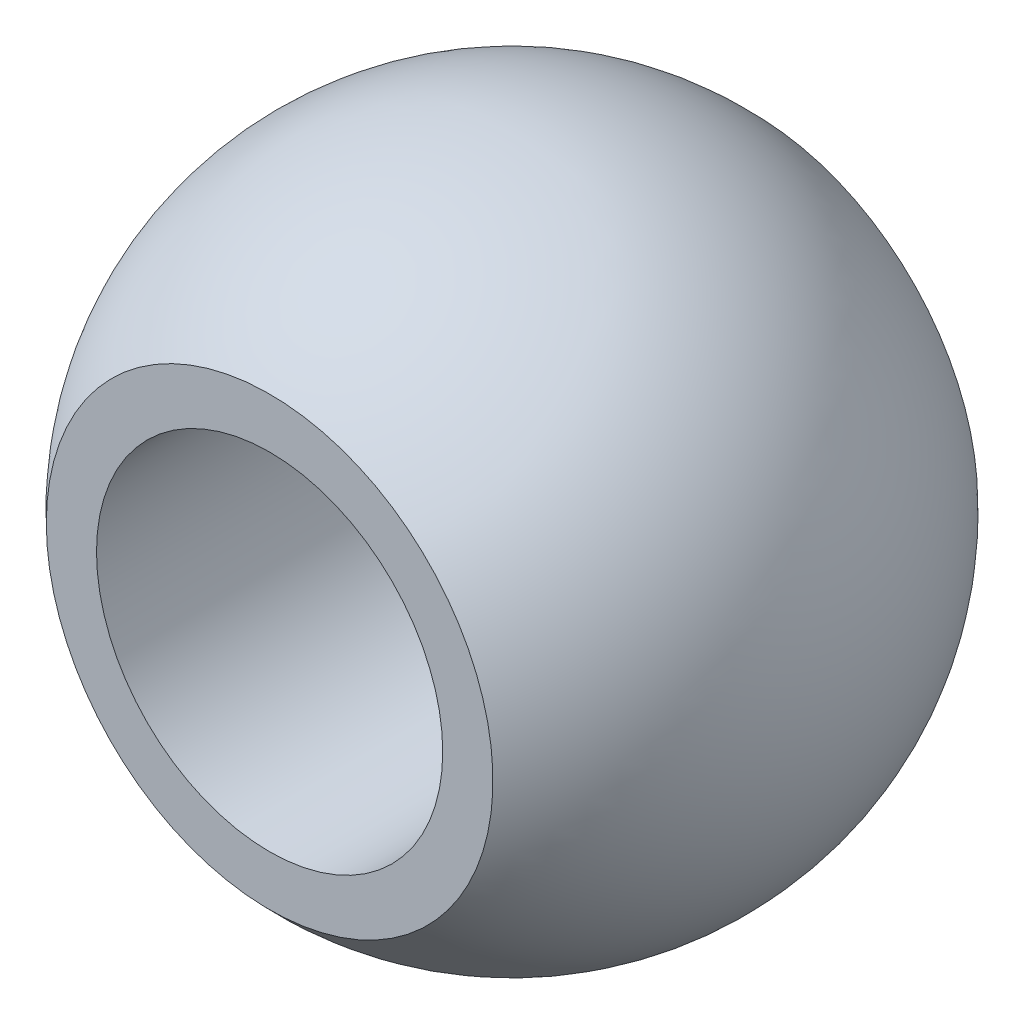
ISO-10303-21;
HEADER;
FILE_DESCRIPTION(('STEP AP214'),'2;1');
FILE_NAME('part.step','',(''),(''),'','','');
FILE_SCHEMA(('AUTOMOTIVE_DESIGN { 1 0 10303 214 1 1 1 1 }'));
ENDSEC;
DATA;
#1=APPLICATION_CONTEXT('core data for automotive mechanical design processes');
#2=APPLICATION_PROTOCOL_DEFINITION('international standard','automotive_design',2000,#1);
#3=PRODUCT_CONTEXT('',#1,'mechanical');
#4=PRODUCT('Part','Part','',(#3));
#5=PRODUCT_RELATED_PRODUCT_CATEGORY('part','',(#4));
#6=PRODUCT_DEFINITION_FORMATION('','',#4);
#7=PRODUCT_DEFINITION_CONTEXT('part definition',#1,'design');
#8=PRODUCT_DEFINITION('design','',#6,#7);
#9=PRODUCT_DEFINITION_SHAPE('','',#8);
#10=(LENGTH_UNIT() NAMED_UNIT(*) SI_UNIT(.MILLI.,.METRE.));
#11=(NAMED_UNIT(*) PLANE_ANGLE_UNIT() SI_UNIT($,.RADIAN.));
#12=(NAMED_UNIT(*) SI_UNIT($,.STERADIAN.) SOLID_ANGLE_UNIT());
#13=UNCERTAINTY_MEASURE_WITH_UNIT(LENGTH_MEASURE(1.E-05),#10,'distance_accuracy_value','');
#14=(GEOMETRIC_REPRESENTATION_CONTEXT(3) GLOBAL_UNCERTAINTY_ASSIGNED_CONTEXT((#13)) GLOBAL_UNIT_ASSIGNED_CONTEXT((#10,
#11,#12)) REPRESENTATION_CONTEXT('',''));
#15=CARTESIAN_POINT('',(0.,0.,0.));
#16=DIRECTION('',(0.,0.,1.));
#17=DIRECTION('',(1.,0.,0.));
#18=AXIS2_PLACEMENT_3D('',#15,#16,#17);
#19=CARTESIAN_POINT('',(0.,0.,0.));
#20=DIRECTION('',(0.,-1.,0.));
#21=DIRECTION('',(-1.,0.,0.));
#22=AXIS2_PLACEMENT_3D('',#19,#20,#21);
#23=SPHERICAL_SURFACE('',#22,9.51853455);
#24=CARTESIAN_POINT('',(0.,0.,0.));
#25=DIRECTION('',(0.,0.,-1.));
#26=DIRECTION('',(-1.,0.,0.));
#27=AXIS2_PLACEMENT_3D('',#24,#25,#26);
#28=SPHERICAL_SURFACE('',#27,9.51853455);
#29=CARTESIAN_POINT('',(0.,0.,7.));
#30=DIRECTION('',(0.,0.,-1.));
#31=DIRECTION('',(-1.,0.,0.));
#32=AXIS2_PLACEMENT_3D('',#29,#30,#31);
#33=CIRCLE('',#32,6.44999999841424);
#34=CARTESIAN_POINT('',(-6.44999999841424,0.,7.));
#35=VERTEX_POINT('',#34);
#36=EDGE_CURVE('E49',#35,#35,#33,.F.);
#37=ORIENTED_EDGE('',*,*,#36,.F.);
#38=EDGE_LOOP('',(#37));
#39=FACE_BOUND('',#38,.T.);
#40=CARTESIAN_POINT('',(0.,0.,-7.));
#41=DIRECTION('',(0.,0.,1.));
#42=DIRECTION('',(1.,0.,0.));
#43=AXIS2_PLACEMENT_3D('',#40,#41,#42);
#44=CIRCLE('',#43,6.44999999841424);
#45=CARTESIAN_POINT('',(6.44999999841424,0.,-7.));
#46=VERTEX_POINT('',#45);
#47=EDGE_CURVE('E10',#46,#46,#44,.F.);
#48=ORIENTED_EDGE('',*,*,#47,.F.);
#49=EDGE_LOOP('',(#48));
#50=FACE_BOUND('',#49,.T.);
#51=ADVANCED_FACE('F37',(#39,#50),#28,.T.);
#52=CARTESIAN_POINT('',(0.,0.,-17.5));
#53=DIRECTION('',(0.,0.,1.));
#54=DIRECTION('',(1.,0.,0.));
#55=AXIS2_PLACEMENT_3D('',#52,#53,#54);
#56=CYLINDRICAL_SURFACE('',#55,5.);
#57=CARTESIAN_POINT('',(0.,0.,7.));
#58=DIRECTION('',(0.,0.,-1.));
#59=DIRECTION('',(-1.,0.,0.));
#60=AXIS2_PLACEMENT_3D('',#57,#58,#59);
#61=CIRCLE('',#60,5.);
#62=CARTESIAN_POINT('',(-5.,0.,7.));
#63=VERTEX_POINT('',#62);
#64=EDGE_CURVE('E40',#63,#63,#61,.F.);
#65=ORIENTED_EDGE('',*,*,#64,.T.);
#66=EDGE_LOOP('',(#65));
#67=FACE_BOUND('',#66,.T.);
#68=CARTESIAN_POINT('',(0.,0.,-7.));
#69=DIRECTION('',(0.,0.,1.));
#70=DIRECTION('',(1.,0.,0.));
#71=AXIS2_PLACEMENT_3D('',#68,#69,#70);
#72=CIRCLE('',#71,5.);
#73=CARTESIAN_POINT('',(5.,0.,-7.));
#74=VERTEX_POINT('',#73);
#75=EDGE_CURVE('E44',#74,#74,#72,.F.);
#76=ORIENTED_EDGE('',*,*,#75,.T.);
#77=EDGE_LOOP('',(#76));
#78=FACE_BOUND('',#77,.T.);
#79=ADVANCED_FACE('F57',(#67,#78),#56,.F.);
#80=CARTESIAN_POINT('',(0.,-13.5,-7.));
#81=DIRECTION('',(0.,0.,1.));
#82=DIRECTION('',(1.,0.,0.));
#83=AXIS2_PLACEMENT_3D('',#80,#81,#82);
#84=PLANE('',#83);
#85=ORIENTED_EDGE('',*,*,#47,.T.);
#86=EDGE_LOOP('',(#85));
#87=FACE_BOUND('',#86,.T.);
#88=ORIENTED_EDGE('',*,*,#75,.F.);
#89=EDGE_LOOP('',(#88));
#90=FACE_BOUND('',#89,.T.);
#91=ADVANCED_FACE('F62',(#87,#90),#84,.F.);
#92=CARTESIAN_POINT('',(0.,-13.5,7.));
#93=DIRECTION('',(0.,0.,-1.));
#94=DIRECTION('',(-1.,0.,0.));
#95=AXIS2_PLACEMENT_3D('',#92,#93,#94);
#96=PLANE('',#95);
#97=ORIENTED_EDGE('',*,*,#36,.T.);
#98=EDGE_LOOP('',(#97));
#99=FACE_BOUND('',#98,.T.);
#100=ORIENTED_EDGE('',*,*,#64,.F.);
#101=EDGE_LOOP('',(#100));
#102=FACE_BOUND('',#101,.T.);
#103=ADVANCED_FACE('F60',(#99,#102),#96,.F.);
#104=CLOSED_SHELL('',(#51,#79,#91,#103));
#105=MANIFOLD_SOLID_BREP('B2',#104);
#106=ADVANCED_BREP_SHAPE_REPRESENTATION('',(#18,#105),#14);
#107=SHAPE_DEFINITION_REPRESENTATION(#9,#106);
ENDSEC;
END-ISO-10303-21;
